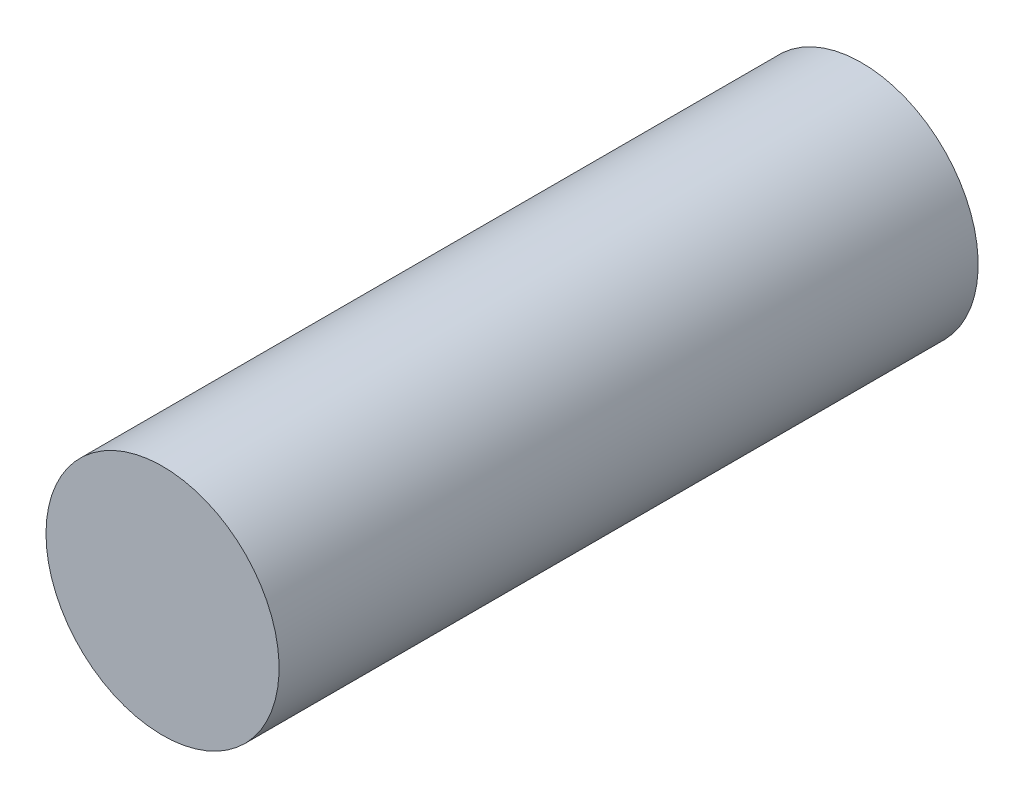
ISO-10303-21;
HEADER;
FILE_DESCRIPTION(('STEP AP214'),'2;1');
FILE_NAME('part.step','',(''),(''),'','','');
FILE_SCHEMA(('AUTOMOTIVE_DESIGN { 1 0 10303 214 1 1 1 1 }'));
ENDSEC;
DATA;
#1=APPLICATION_CONTEXT('core data for automotive mechanical design processes');
#2=APPLICATION_PROTOCOL_DEFINITION('international standard','automotive_design',2000,#1);
#3=PRODUCT_CONTEXT('',#1,'mechanical');
#4=PRODUCT('Part','Part','',(#3));
#5=PRODUCT_RELATED_PRODUCT_CATEGORY('part','',(#4));
#6=PRODUCT_DEFINITION_FORMATION('','',#4);
#7=PRODUCT_DEFINITION_CONTEXT('part definition',#1,'design');
#8=PRODUCT_DEFINITION('design','',#6,#7);
#9=PRODUCT_DEFINITION_SHAPE('','',#8);
#10=(LENGTH_UNIT() NAMED_UNIT(*) SI_UNIT(.MILLI.,.METRE.));
#11=(NAMED_UNIT(*) PLANE_ANGLE_UNIT() SI_UNIT($,.RADIAN.));
#12=(NAMED_UNIT(*) SI_UNIT($,.STERADIAN.) SOLID_ANGLE_UNIT());
#13=UNCERTAINTY_MEASURE_WITH_UNIT(LENGTH_MEASURE(1.E-05),#10,'distance_accuracy_value','');
#14=(GEOMETRIC_REPRESENTATION_CONTEXT(3) GLOBAL_UNCERTAINTY_ASSIGNED_CONTEXT((#13)) GLOBAL_UNIT_ASSIGNED_CONTEXT((#10,
#11,#12)) REPRESENTATION_CONTEXT('',''));
#15=CARTESIAN_POINT('',(0.,0.,0.));
#16=DIRECTION('',(0.,0.,1.));
#17=DIRECTION('',(1.,0.,0.));
#18=AXIS2_PLACEMENT_3D('',#15,#16,#17);
#19=CARTESIAN_POINT('',(0.,0.,102.96));
#20=DIRECTION('',(0.,0.,1.));
#21=DIRECTION('',(1.,0.,0.));
#22=AXIS2_PLACEMENT_3D('',#19,#20,#21);
#23=PLANE('',#22);
#24=CARTESIAN_POINT('',(0.,0.,102.96));
#25=DIRECTION('',(0.,0.,-1.));
#26=DIRECTION('',(-1.,0.,0.));
#27=AXIS2_PLACEMENT_3D('',#24,#25,#26);
#28=CIRCLE('',#27,17.1640859852941);
#29=CARTESIAN_POINT('',(-17.1640859852941,0.,102.96));
#30=VERTEX_POINT('',#29);
#31=EDGE_CURVE('E18',#30,#30,#28,.T.);
#32=ORIENTED_EDGE('',*,*,#31,.F.);
#33=EDGE_LOOP('',(#32));
#34=FACE_BOUND('',#33,.T.);
#35=ADVANCED_FACE('F15',(#34),#23,.T.);
#36=CARTESIAN_POINT('',(0.,0.,0.));
#37=DIRECTION('',(0.,0.,1.));
#38=DIRECTION('',(1.,0.,0.));
#39=AXIS2_PLACEMENT_3D('',#36,#37,#38);
#40=PLANE('',#39);
#41=CARTESIAN_POINT('',(0.,0.,0.));
#42=DIRECTION('',(0.,0.,-1.));
#43=DIRECTION('',(-1.,0.,0.));
#44=AXIS2_PLACEMENT_3D('',#41,#42,#43);
#45=CIRCLE('',#44,17.1640859852941);
#46=CARTESIAN_POINT('',(-17.1640859852941,0.,0.));
#47=VERTEX_POINT('',#46);
#48=EDGE_CURVE('E10',#47,#47,#45,.F.);
#49=ORIENTED_EDGE('',*,*,#48,.F.);
#50=EDGE_LOOP('',(#49));
#51=FACE_BOUND('',#50,.T.);
#52=ADVANCED_FACE('F30',(#51),#40,.F.);
#53=CARTESIAN_POINT('',(0.,0.,102.96));
#54=DIRECTION('',(0.,0.,-1.));
#55=DIRECTION('',(-1.,0.,0.));
#56=AXIS2_PLACEMENT_3D('',#53,#54,#55);
#57=CYLINDRICAL_SURFACE('',#56,17.1640859852941);
#58=ORIENTED_EDGE('',*,*,#48,.T.);
#59=EDGE_LOOP('',(#58));
#60=FACE_BOUND('',#59,.T.);
#61=ORIENTED_EDGE('',*,*,#31,.T.);
#62=EDGE_LOOP('',(#61));
#63=FACE_BOUND('',#62,.T.);
#64=ADVANCED_FACE('F27',(#60,#63),#57,.T.);
#65=CLOSED_SHELL('',(#35,#52,#64));
#66=MANIFOLD_SOLID_BREP('B1',#65);
#67=ADVANCED_BREP_SHAPE_REPRESENTATION('',(#18,#66),#14);
#68=SHAPE_DEFINITION_REPRESENTATION(#9,#67);
ENDSEC;
END-ISO-10303-21;
